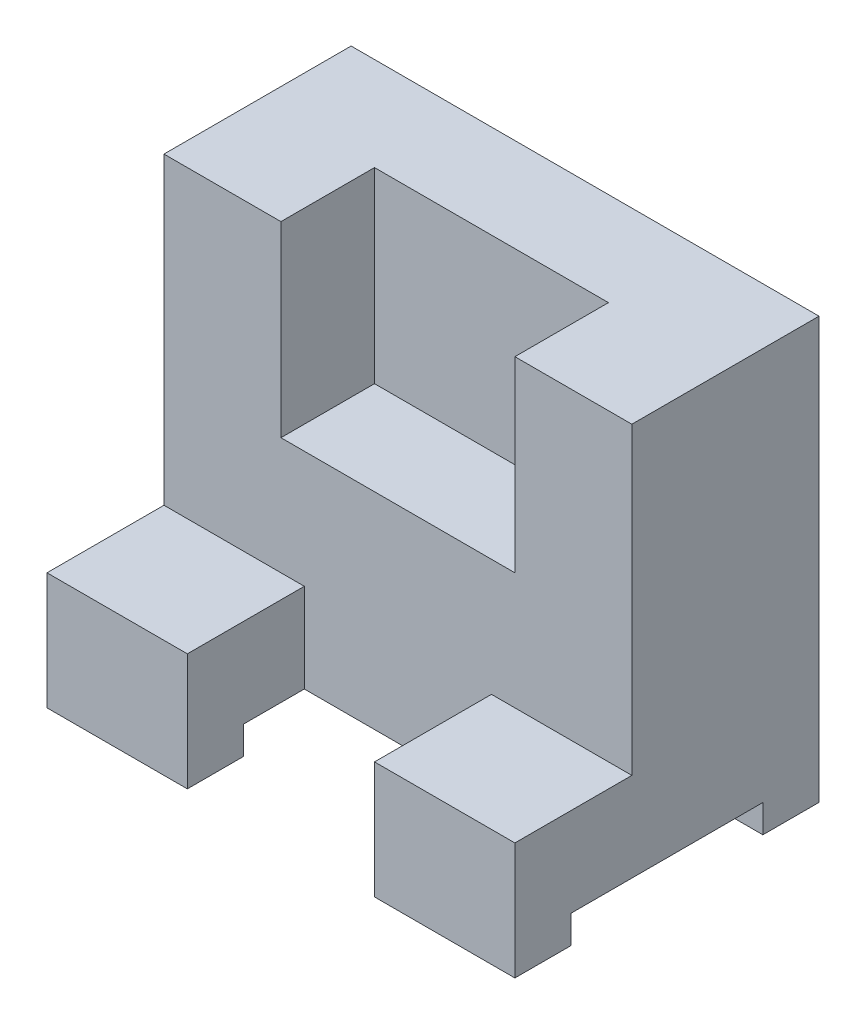
ISO-10303-21;
HEADER;
FILE_DESCRIPTION(('STEP AP214'),'2;1');
FILE_NAME('part.step','',(''),(''),'','','');
FILE_SCHEMA(('AUTOMOTIVE_DESIGN { 1 0 10303 214 1 1 1 1 }'));
ENDSEC;
DATA;
#1=APPLICATION_CONTEXT('core data for automotive mechanical design processes');
#2=APPLICATION_PROTOCOL_DEFINITION('international standard','automotive_design',2000,#1);
#3=PRODUCT_CONTEXT('',#1,'mechanical');
#4=PRODUCT('Part','Part','',(#3));
#5=PRODUCT_RELATED_PRODUCT_CATEGORY('part','',(#4));
#6=PRODUCT_DEFINITION_FORMATION('','',#4);
#7=PRODUCT_DEFINITION_CONTEXT('part definition',#1,'design');
#8=PRODUCT_DEFINITION('design','',#6,#7);
#9=PRODUCT_DEFINITION_SHAPE('','',#8);
#10=(LENGTH_UNIT() NAMED_UNIT(*) SI_UNIT(.MILLI.,.METRE.));
#11=(NAMED_UNIT(*) PLANE_ANGLE_UNIT() SI_UNIT($,.RADIAN.));
#12=(NAMED_UNIT(*) SI_UNIT($,.STERADIAN.) SOLID_ANGLE_UNIT());
#13=UNCERTAINTY_MEASURE_WITH_UNIT(LENGTH_MEASURE(1.E-05),#10,'distance_accuracy_value','');
#14=(GEOMETRIC_REPRESENTATION_CONTEXT(3) GLOBAL_UNCERTAINTY_ASSIGNED_CONTEXT((#13)) GLOBAL_UNIT_ASSIGNED_CONTEXT((#10,
#11,#12)) REPRESENTATION_CONTEXT('',''));
#15=CARTESIAN_POINT('',(0.,0.,0.));
#16=DIRECTION('',(0.,0.,1.));
#17=DIRECTION('',(1.,0.,0.));
#18=AXIS2_PLACEMENT_3D('',#15,#16,#17);
#19=CARTESIAN_POINT('',(0.,0.,0.));
#20=DIRECTION('',(0.,1.,0.));
#21=DIRECTION('',(0.,0.,1.));
#22=AXIS2_PLACEMENT_3D('',#19,#20,#21);
#23=PLANE('',#22);
#24=DIRECTION('',(1.,0.,0.));
#25=VECTOR('',#24,1.);
#26=CARTESIAN_POINT('',(-50.,0.,32.5));
#27=LINE('',#26,#25);
#28=CARTESIAN_POINT('',(20.,0.,32.5));
#29=VERTEX_POINT('',#28);
#30=CARTESIAN_POINT('',(50.,0.,32.5));
#31=VERTEX_POINT('',#30);
#32=EDGE_CURVE('E232',#29,#31,#27,.T.);
#33=ORIENTED_EDGE('',*,*,#32,.F.);
#34=DIRECTION('',(0.,0.,1.));
#35=VECTOR('',#34,1.);
#36=CARTESIAN_POINT('',(20.,0.,-39.6699056602831));
#37=LINE('',#36,#35);
#38=CARTESIAN_POINT('',(20.,0.,20.5));
#39=VERTEX_POINT('',#38);
#40=EDGE_CURVE('E335',#39,#29,#37,.T.);
#41=ORIENTED_EDGE('',*,*,#40,.F.);
#42=DIRECTION('',(1.,0.,0.));
#43=VECTOR('',#42,1.);
#44=CARTESIAN_POINT('',(-50.,0.,20.5));
#45=LINE('',#44,#43);
#46=CARTESIAN_POINT('',(50.,0.,20.5));
#47=VERTEX_POINT('',#46);
#48=EDGE_CURVE('E255',#39,#47,#45,.T.);
#49=ORIENTED_EDGE('',*,*,#48,.T.);
#50=DIRECTION('',(0.,0.,-1.));
#51=VECTOR('',#50,1.);
#52=CARTESIAN_POINT('',(50.,0.,-32.5));
#53=LINE('',#52,#51);
#54=EDGE_CURVE('E223',#31,#47,#53,.T.);
#55=ORIENTED_EDGE('',*,*,#54,.F.);
#56=EDGE_LOOP('',(#33,#41,#49,#55));
#57=FACE_BOUND('',#56,.T.);
#58=ADVANCED_FACE('F37',(#57),#23,.F.);
#59=CARTESIAN_POINT('',(0.,25.,0.));
#60=DIRECTION('',(0.,1.,0.));
#61=DIRECTION('',(0.,0.,1.));
#62=AXIS2_PLACEMENT_3D('',#59,#60,#61);
#63=PLANE('',#62);
#64=DIRECTION('',(0.,0.,1.));
#65=VECTOR('',#64,1.);
#66=CARTESIAN_POINT('',(20.,25.,-39.6699056602831));
#67=LINE('',#66,#65);
#68=CARTESIAN_POINT('',(20.,25.,7.5));
#69=VERTEX_POINT('',#68);
#70=CARTESIAN_POINT('',(20.,25.,32.5));
#71=VERTEX_POINT('',#70);
#72=EDGE_CURVE('E185',#69,#71,#67,.T.);
#73=ORIENTED_EDGE('',*,*,#72,.T.);
#74=DIRECTION('',(1.,0.,0.));
#75=VECTOR('',#74,1.);
#76=CARTESIAN_POINT('',(-50.,25.,32.5));
#77=LINE('',#76,#75);
#78=CARTESIAN_POINT('',(50.,25.,32.5));
#79=VERTEX_POINT('',#78);
#80=EDGE_CURVE('E218',#71,#79,#77,.T.);
#81=ORIENTED_EDGE('',*,*,#80,.T.);
#82=DIRECTION('',(0.,0.,-1.));
#83=VECTOR('',#82,1.);
#84=CARTESIAN_POINT('',(50.,25.,-32.5));
#85=LINE('',#84,#83);
#86=CARTESIAN_POINT('',(50.,25.,7.5));
#87=VERTEX_POINT('',#86);
#88=EDGE_CURVE('E198',#79,#87,#85,.T.);
#89=ORIENTED_EDGE('',*,*,#88,.T.);
#90=DIRECTION('',(-1.,0.,0.));
#91=VECTOR('',#90,1.);
#92=CARTESIAN_POINT('',(50.,25.,7.5));
#93=LINE('',#92,#91);
#94=EDGE_CURVE('E180',#87,#69,#93,.T.);
#95=ORIENTED_EDGE('',*,*,#94,.T.);
#96=EDGE_LOOP('',(#73,#81,#89,#95));
#97=FACE_BOUND('',#96,.T.);
#98=ADVANCED_FACE('F196',(#97),#63,.T.);
#99=CARTESIAN_POINT('',(-50.,25.,32.5));
#100=DIRECTION('',(0.,0.,-1.));
#101=DIRECTION('',(-1.,0.,0.));
#102=AXIS2_PLACEMENT_3D('',#99,#100,#101);
#103=PLANE('',#102);
#104=ORIENTED_EDGE('',*,*,#80,.F.);
#105=DIRECTION('',(0.,1.,0.));
#106=VECTOR('',#105,1.);
#107=CARTESIAN_POINT('',(20.,25.,32.5));
#108=LINE('',#107,#106);
#109=EDGE_CURVE('E191',#29,#71,#108,.T.);
#110=ORIENTED_EDGE('',*,*,#109,.F.);
#111=ORIENTED_EDGE('',*,*,#32,.T.);
#112=DIRECTION('',(0.,-1.,0.));
#113=VECTOR('',#112,1.);
#114=CARTESIAN_POINT('',(50.,25.,32.5));
#115=LINE('',#114,#113);
#116=EDGE_CURVE('E222',#79,#31,#115,.T.);
#117=ORIENTED_EDGE('',*,*,#116,.F.);
#118=EDGE_LOOP('',(#104,#110,#111,#117));
#119=FACE_BOUND('',#118,.T.);
#120=ADVANCED_FACE('F371',(#119),#103,.F.);
#121=CARTESIAN_POINT('',(-50.,0.,20.5));
#122=DIRECTION('',(0.,0.,1.));
#123=DIRECTION('',(1.,0.,0.));
#124=AXIS2_PLACEMENT_3D('',#121,#122,#123);
#125=PLANE('',#124);
#126=ORIENTED_EDGE('',*,*,#48,.F.);
#127=DIRECTION('',(0.,1.,0.));
#128=VECTOR('',#127,1.);
#129=CARTESIAN_POINT('',(20.,0.,20.5));
#130=LINE('',#129,#128);
#131=CARTESIAN_POINT('',(20.,5.98507619216385,20.5));
#132=VERTEX_POINT('',#131);
#133=EDGE_CURVE('E45',#39,#132,#130,.T.);
#134=ORIENTED_EDGE('',*,*,#133,.T.);
#135=DIRECTION('',(1.,0.,0.));
#136=VECTOR('',#135,1.);
#137=CARTESIAN_POINT('',(-50.,5.98507619216385,20.5));
#138=LINE('',#137,#136);
#139=CARTESIAN_POINT('',(50.,5.98507619216385,20.5));
#140=VERTEX_POINT('',#139);
#141=EDGE_CURVE('E253',#132,#140,#138,.T.);
#142=ORIENTED_EDGE('',*,*,#141,.T.);
#143=DIRECTION('',(0.,1.,0.));
#144=VECTOR('',#143,1.);
#145=CARTESIAN_POINT('',(50.,25.,20.5));
#146=LINE('',#145,#144);
#147=EDGE_CURVE('E279',#47,#140,#146,.T.);
#148=ORIENTED_EDGE('',*,*,#147,.F.);
#149=EDGE_LOOP('',(#126,#134,#142,#148));
#150=FACE_BOUND('',#149,.T.);
#151=ADVANCED_FACE('F251',(#150),#125,.F.);
#152=CARTESIAN_POINT('',(-50.,0.,20.5));
#153=VERTEX_POINT('',#152);
#154=CARTESIAN_POINT('',(-20.,0.,20.5));
#155=VERTEX_POINT('',#154);
#156=EDGE_CURVE('E271',#153,#155,#45,.T.);
#157=ORIENTED_EDGE('',*,*,#156,.T.);
#158=DIRECTION('',(0.,0.,1.));
#159=VECTOR('',#158,1.);
#160=CARTESIAN_POINT('',(-20.,0.,-39.6699056602831));
#161=LINE('',#160,#159);
#162=CARTESIAN_POINT('',(-20.,0.,32.5));
#163=VERTEX_POINT('',#162);
#164=EDGE_CURVE('E52',#155,#163,#161,.T.);
#165=ORIENTED_EDGE('',*,*,#164,.T.);
#166=CARTESIAN_POINT('',(-50.,0.,32.5));
#167=VERTEX_POINT('',#166);
#168=EDGE_CURVE('E216',#167,#163,#27,.T.);
#169=ORIENTED_EDGE('',*,*,#168,.F.);
#170=DIRECTION('',(0.,0.,1.));
#171=VECTOR('',#170,1.);
#172=CARTESIAN_POINT('',(-50.,0.,-32.5));
#173=LINE('',#172,#171);
#174=EDGE_CURVE('E228',#153,#167,#173,.T.);
#175=ORIENTED_EDGE('',*,*,#174,.F.);
#176=EDGE_LOOP('',(#157,#165,#169,#175));
#177=FACE_BOUND('',#176,.T.);
#178=ADVANCED_FACE('F351',(#177),#23,.F.);
#179=DIRECTION('',(0.,0.,1.));
#180=VECTOR('',#179,1.);
#181=CARTESIAN_POINT('',(-20.,25.,-39.6699056602831));
#182=LINE('',#181,#180);
#183=CARTESIAN_POINT('',(-20.,25.,7.5));
#184=VERTEX_POINT('',#183);
#185=CARTESIAN_POINT('',(-20.,25.,32.5));
#186=VERTEX_POINT('',#185);
#187=EDGE_CURVE('E194',#184,#186,#182,.T.);
#188=ORIENTED_EDGE('',*,*,#187,.F.);
#189=CARTESIAN_POINT('',(-50.,25.,7.5));
#190=VERTEX_POINT('',#189);
#191=EDGE_CURVE('E200',#184,#190,#93,.T.);
#192=ORIENTED_EDGE('',*,*,#191,.T.);
#193=DIRECTION('',(0.,0.,1.));
#194=VECTOR('',#193,1.);
#195=CARTESIAN_POINT('',(-50.,25.,-32.5));
#196=LINE('',#195,#194);
#197=CARTESIAN_POINT('',(-50.,25.,32.5));
#198=VERTEX_POINT('',#197);
#199=EDGE_CURVE('E215',#190,#198,#196,.T.);
#200=ORIENTED_EDGE('',*,*,#199,.T.);
#201=EDGE_CURVE('E219',#198,#186,#77,.T.);
#202=ORIENTED_EDGE('',*,*,#201,.T.);
#203=EDGE_LOOP('',(#188,#192,#200,#202));
#204=FACE_BOUND('',#203,.T.);
#205=ADVANCED_FACE('F328',(#204),#63,.T.);
#206=CARTESIAN_POINT('',(50.,25.,-32.5));
#207=DIRECTION('',(-1.,0.,0.));
#208=DIRECTION('',(0.,0.,1.));
#209=AXIS2_PLACEMENT_3D('',#206,#207,#208);
#210=PLANE('',#209);
#211=ORIENTED_EDGE('',*,*,#54,.T.);
#212=ORIENTED_EDGE('',*,*,#147,.T.);
#213=DIRECTION('',(0.,0.,-1.));
#214=VECTOR('',#213,1.);
#215=CARTESIAN_POINT('',(50.,5.98507619216385,-32.5));
#216=LINE('',#215,#214);
#217=CARTESIAN_POINT('',(50.,5.98507619216385,-20.5));
#218=VERTEX_POINT('',#217);
#219=EDGE_CURVE('E262',#140,#218,#216,.T.);
#220=ORIENTED_EDGE('',*,*,#219,.T.);
#221=DIRECTION('',(0.,-1.,0.));
#222=VECTOR('',#221,1.);
#223=CARTESIAN_POINT('',(50.,25.,-20.5));
#224=LINE('',#223,#222);
#225=CARTESIAN_POINT('',(50.,0.,-20.5));
#226=VERTEX_POINT('',#225);
#227=EDGE_CURVE('E276',#218,#226,#224,.T.);
#228=ORIENTED_EDGE('',*,*,#227,.T.);
#229=CARTESIAN_POINT('',(50.,0.,-32.5));
#230=VERTEX_POINT('',#229);
#231=EDGE_CURVE('E213',#226,#230,#53,.T.);
#232=ORIENTED_EDGE('',*,*,#231,.T.);
#233=DIRECTION('',(0.,-1.,0.));
#234=VECTOR('',#233,1.);
#235=CARTESIAN_POINT('',(50.,25.,-32.5));
#236=LINE('',#235,#234);
#237=CARTESIAN_POINT('',(50.,90.,-32.5));
#238=VERTEX_POINT('',#237);
#239=EDGE_CURVE('E243',#238,#230,#236,.T.);
#240=ORIENTED_EDGE('',*,*,#239,.F.);
#241=DIRECTION('',(0.,0.,1.));
#242=VECTOR('',#241,1.);
#243=CARTESIAN_POINT('',(50.,90.,-32.5));
#244=LINE('',#243,#242);
#245=CARTESIAN_POINT('',(50.,90.,7.50000000000001));
#246=VERTEX_POINT('',#245);
#247=EDGE_CURVE('E311',#238,#246,#244,.T.);
#248=ORIENTED_EDGE('',*,*,#247,.T.);
#249=DIRECTION('',(0.,-1.,0.));
#250=VECTOR('',#249,1.);
#251=CARTESIAN_POINT('',(50.,90.,7.50000000000001));
#252=LINE('',#251,#250);
#253=EDGE_CURVE('E204',#246,#87,#252,.T.);
#254=ORIENTED_EDGE('',*,*,#253,.T.);
#255=ORIENTED_EDGE('',*,*,#88,.F.);
#256=ORIENTED_EDGE('',*,*,#116,.T.);
#257=EDGE_LOOP('',(#211,#212,#220,#228,#232,#240,#248,#254,#255,#256));
#258=FACE_BOUND('',#257,.T.);
#259=ADVANCED_FACE('F39',(#258),#210,.F.);
#260=CARTESIAN_POINT('',(-50.,25.,-32.5));
#261=DIRECTION('',(0.,0.,1.));
#262=DIRECTION('',(1.,0.,0.));
#263=AXIS2_PLACEMENT_3D('',#260,#261,#262);
#264=PLANE('',#263);
#265=DIRECTION('',(-1.,0.,0.));
#266=VECTOR('',#265,1.);
#267=CARTESIAN_POINT('',(-50.,0.,-32.5));
#268=LINE('',#267,#266);
#269=CARTESIAN_POINT('',(-50.,0.,-32.5));
#270=VERTEX_POINT('',#269);
#271=EDGE_CURVE('E226',#230,#270,#268,.T.);
#272=ORIENTED_EDGE('',*,*,#271,.T.);
#273=DIRECTION('',(0.,-1.,0.));
#274=VECTOR('',#273,1.);
#275=CARTESIAN_POINT('',(-50.,25.,-32.5));
#276=LINE('',#275,#274);
#277=CARTESIAN_POINT('',(-50.,90.,-32.5));
#278=VERTEX_POINT('',#277);
#279=EDGE_CURVE('E240',#278,#270,#276,.T.);
#280=ORIENTED_EDGE('',*,*,#279,.F.);
#281=DIRECTION('',(-1.,0.,0.));
#282=VECTOR('',#281,1.);
#283=CARTESIAN_POINT('',(50.,90.,-32.5));
#284=LINE('',#283,#282);
#285=EDGE_CURVE('E210',#238,#278,#284,.T.);
#286=ORIENTED_EDGE('',*,*,#285,.F.);
#287=ORIENTED_EDGE('',*,*,#239,.T.);
#288=EDGE_LOOP('',(#272,#280,#286,#287));
#289=FACE_BOUND('',#288,.T.);
#290=ADVANCED_FACE('F390',(#289),#264,.F.);
#291=CARTESIAN_POINT('',(-50.,25.,-32.5));
#292=DIRECTION('',(1.,0.,0.));
#293=DIRECTION('',(0.,0.,-1.));
#294=AXIS2_PLACEMENT_3D('',#291,#292,#293);
#295=PLANE('',#294);
#296=DIRECTION('',(0.,0.,1.));
#297=VECTOR('',#296,1.);
#298=CARTESIAN_POINT('',(-50.,5.98507619216385,20.5));
#299=LINE('',#298,#297);
#300=CARTESIAN_POINT('',(-50.,5.98507619216385,-20.5));
#301=VERTEX_POINT('',#300);
#302=CARTESIAN_POINT('',(-50.,5.98507619216385,20.5));
#303=VERTEX_POINT('',#302);
#304=EDGE_CURVE('E342',#301,#303,#299,.T.);
#305=ORIENTED_EDGE('',*,*,#304,.T.);
#306=DIRECTION('',(0.,-1.,0.));
#307=VECTOR('',#306,1.);
#308=CARTESIAN_POINT('',(-50.,0.,20.5));
#309=LINE('',#308,#307);
#310=EDGE_CURVE('E275',#303,#153,#309,.T.);
#311=ORIENTED_EDGE('',*,*,#310,.T.);
#312=ORIENTED_EDGE('',*,*,#174,.T.);
#313=DIRECTION('',(0.,-1.,0.));
#314=VECTOR('',#313,1.);
#315=CARTESIAN_POINT('',(-50.,25.,32.5));
#316=LINE('',#315,#314);
#317=EDGE_CURVE('E237',#198,#167,#316,.T.);
#318=ORIENTED_EDGE('',*,*,#317,.F.);
#319=ORIENTED_EDGE('',*,*,#199,.F.);
#320=DIRECTION('',(0.,-1.,0.));
#321=VECTOR('',#320,1.);
#322=CARTESIAN_POINT('',(-50.,90.,7.50000000000001));
#323=LINE('',#322,#321);
#324=CARTESIAN_POINT('',(-50.,90.,7.50000000000001));
#325=VERTEX_POINT('',#324);
#326=EDGE_CURVE('E206',#325,#190,#323,.T.);
#327=ORIENTED_EDGE('',*,*,#326,.F.);
#328=DIRECTION('',(0.,0.,1.));
#329=VECTOR('',#328,1.);
#330=CARTESIAN_POINT('',(-50.,90.,-32.5));
#331=LINE('',#330,#329);
#332=EDGE_CURVE('E305',#278,#325,#331,.T.);
#333=ORIENTED_EDGE('',*,*,#332,.F.);
#334=ORIENTED_EDGE('',*,*,#279,.T.);
#335=CARTESIAN_POINT('',(-50.,0.,-20.5));
#336=VERTEX_POINT('',#335);
#337=EDGE_CURVE('E229',#270,#336,#173,.T.);
#338=ORIENTED_EDGE('',*,*,#337,.T.);
#339=DIRECTION('',(0.,1.,0.));
#340=VECTOR('',#339,1.);
#341=CARTESIAN_POINT('',(-50.,5.98507619216385,-20.5));
#342=LINE('',#341,#340);
#343=EDGE_CURVE('E60',#336,#301,#342,.T.);
#344=ORIENTED_EDGE('',*,*,#343,.T.);
#345=EDGE_LOOP('',(#305,#311,#312,#318,#319,#327,#333,#334,#338,#344));
#346=FACE_BOUND('',#345,.T.);
#347=ADVANCED_FACE('F324',(#346),#295,.F.);
#348=ORIENTED_EDGE('',*,*,#168,.T.);
#349=DIRECTION('',(0.,-1.,0.));
#350=VECTOR('',#349,1.);
#351=CARTESIAN_POINT('',(-20.,0.,32.5));
#352=LINE('',#351,#350);
#353=EDGE_CURVE('E186',#186,#163,#352,.T.);
#354=ORIENTED_EDGE('',*,*,#353,.F.);
#355=ORIENTED_EDGE('',*,*,#201,.F.);
#356=ORIENTED_EDGE('',*,*,#317,.T.);
#357=EDGE_LOOP('',(#348,#354,#355,#356));
#358=FACE_BOUND('',#357,.T.);
#359=ADVANCED_FACE('F353',(#358),#103,.F.);
#360=ORIENTED_EDGE('',*,*,#231,.F.);
#361=DIRECTION('',(1.,0.,0.));
#362=VECTOR('',#361,1.);
#363=CARTESIAN_POINT('',(-50.,0.,-20.5));
#364=LINE('',#363,#362);
#365=EDGE_CURVE('E268',#336,#226,#364,.T.);
#366=ORIENTED_EDGE('',*,*,#365,.F.);
#367=ORIENTED_EDGE('',*,*,#337,.F.);
#368=ORIENTED_EDGE('',*,*,#271,.F.);
#369=EDGE_LOOP('',(#360,#366,#367,#368));
#370=FACE_BOUND('',#369,.T.);
#371=ADVANCED_FACE('F367',(#370),#23,.F.);
#372=CARTESIAN_POINT('',(50.,90.,-32.5));
#373=DIRECTION('',(0.,-1.,0.));
#374=DIRECTION('',(0.,0.,-1.));
#375=AXIS2_PLACEMENT_3D('',#372,#373,#374);
#376=PLANE('',#375);
#377=DIRECTION('',(-1.,0.,0.));
#378=VECTOR('',#377,1.);
#379=CARTESIAN_POINT('',(50.,90.,7.50000000000001));
#380=LINE('',#379,#378);
#381=CARTESIAN_POINT('',(-25.,90.,7.49999999999997));
#382=VERTEX_POINT('',#381);
#383=EDGE_CURVE('E199',#382,#325,#380,.T.);
#384=ORIENTED_EDGE('',*,*,#383,.F.);
#385=DIRECTION('',(0.,0.,1.));
#386=VECTOR('',#385,1.);
#387=CARTESIAN_POINT('',(-25.,90.,7.49999999999997));
#388=LINE('',#387,#386);
#389=CARTESIAN_POINT('',(-25.,90.,-12.5));
#390=VERTEX_POINT('',#389);
#391=EDGE_CURVE('E287',#390,#382,#388,.T.);
#392=ORIENTED_EDGE('',*,*,#391,.F.);
#393=DIRECTION('',(-1.,0.,0.));
#394=VECTOR('',#393,1.);
#395=CARTESIAN_POINT('',(-25.,90.,-12.5));
#396=LINE('',#395,#394);
#397=CARTESIAN_POINT('',(25.,90.,-12.5));
#398=VERTEX_POINT('',#397);
#399=EDGE_CURVE('E298',#398,#390,#396,.T.);
#400=ORIENTED_EDGE('',*,*,#399,.F.);
#401=DIRECTION('',(0.,0.,-1.));
#402=VECTOR('',#401,1.);
#403=CARTESIAN_POINT('',(25.,90.,-12.5));
#404=LINE('',#403,#402);
#405=CARTESIAN_POINT('',(25.,90.,7.49999999999997));
#406=VERTEX_POINT('',#405);
#407=EDGE_CURVE('E282',#406,#398,#404,.T.);
#408=ORIENTED_EDGE('',*,*,#407,.F.);
#409=EDGE_CURVE('E202',#246,#406,#380,.T.);
#410=ORIENTED_EDGE('',*,*,#409,.F.);
#411=ORIENTED_EDGE('',*,*,#247,.F.);
#412=ORIENTED_EDGE('',*,*,#285,.T.);
#413=ORIENTED_EDGE('',*,*,#332,.T.);
#414=EDGE_LOOP('',(#384,#392,#400,#408,#410,#411,#412,#413));
#415=FACE_BOUND('',#414,.T.);
#416=ADVANCED_FACE('F377',(#415),#376,.F.);
#417=CARTESIAN_POINT('',(50.,90.,7.50000000000001));
#418=DIRECTION('',(0.,0.,-1.));
#419=DIRECTION('',(0.,1.,0.));
#420=AXIS2_PLACEMENT_3D('',#417,#418,#419);
#421=PLANE('',#420);
#422=DIRECTION('',(1.,0.,0.));
#423=VECTOR('',#422,1.);
#424=CARTESIAN_POINT('',(25.,50.,7.49999999999995));
#425=LINE('',#424,#423);
#426=CARTESIAN_POINT('',(-25.,50.,7.5));
#427=VERTEX_POINT('',#426);
#428=CARTESIAN_POINT('',(25.,50.,7.49999999999995));
#429=VERTEX_POINT('',#428);
#430=EDGE_CURVE('E283',#427,#429,#425,.T.);
#431=ORIENTED_EDGE('',*,*,#430,.F.);
#432=DIRECTION('',(0.,1.,0.));
#433=VECTOR('',#432,1.);
#434=CARTESIAN_POINT('',(-25.,50.,7.49999999999995));
#435=LINE('',#434,#433);
#436=EDGE_CURVE('E302',#427,#382,#435,.T.);
#437=ORIENTED_EDGE('',*,*,#436,.T.);
#438=ORIENTED_EDGE('',*,*,#383,.T.);
#439=ORIENTED_EDGE('',*,*,#326,.T.);
#440=ORIENTED_EDGE('',*,*,#191,.F.);
#441=DIRECTION('',(0.,-1.,0.));
#442=VECTOR('',#441,1.);
#443=CARTESIAN_POINT('',(-20.,0.,7.5));
#444=LINE('',#443,#442);
#445=CARTESIAN_POINT('',(-20.,5.98507619216385,7.5));
#446=VERTEX_POINT('',#445);
#447=EDGE_CURVE('E330',#184,#446,#444,.T.);
#448=ORIENTED_EDGE('',*,*,#447,.T.);
#449=DIRECTION('',(-1.,0.,0.));
#450=VECTOR('',#449,1.);
#451=CARTESIAN_POINT('',(-50.,5.98507619216385,7.5));
#452=LINE('',#451,#450);
#453=CARTESIAN_POINT('',(20.,5.98507619216385,7.5));
#454=VERTEX_POINT('',#453);
#455=EDGE_CURVE('E11',#454,#446,#452,.T.);
#456=ORIENTED_EDGE('',*,*,#455,.F.);
#457=DIRECTION('',(0.,1.,0.));
#458=VECTOR('',#457,1.);
#459=CARTESIAN_POINT('',(20.,25.,7.5));
#460=LINE('',#459,#458);
#461=EDGE_CURVE('E174',#454,#69,#460,.T.);
#462=ORIENTED_EDGE('',*,*,#461,.T.);
#463=ORIENTED_EDGE('',*,*,#94,.F.);
#464=ORIENTED_EDGE('',*,*,#253,.F.);
#465=ORIENTED_EDGE('',*,*,#409,.T.);
#466=DIRECTION('',(0.,1.,0.));
#467=VECTOR('',#466,1.);
#468=CARTESIAN_POINT('',(25.,50.,7.49999999999995));
#469=LINE('',#468,#467);
#470=EDGE_CURVE('E295',#429,#406,#469,.T.);
#471=ORIENTED_EDGE('',*,*,#470,.F.);
#472=EDGE_LOOP('',(#431,#437,#438,#439,#440,#448,#456,#462,#463,#464,#465,#471));
#473=FACE_BOUND('',#472,.T.);
#474=ADVANCED_FACE('F177',(#473),#421,.F.);
#475=CARTESIAN_POINT('',(-25.,50.,7.49999999999995));
#476=DIRECTION('',(-1.,0.,0.));
#477=DIRECTION('',(0.,0.,1.));
#478=AXIS2_PLACEMENT_3D('',#475,#476,#477);
#479=PLANE('',#478);
#480=ORIENTED_EDGE('',*,*,#391,.T.);
#481=ORIENTED_EDGE('',*,*,#436,.F.);
#482=DIRECTION('',(0.,0.,1.));
#483=VECTOR('',#482,1.);
#484=CARTESIAN_POINT('',(-25.,50.,7.49999999999995));
#485=LINE('',#484,#483);
#486=CARTESIAN_POINT('',(-25.,50.,-12.5));
#487=VERTEX_POINT('',#486);
#488=EDGE_CURVE('E293',#487,#427,#485,.T.);
#489=ORIENTED_EDGE('',*,*,#488,.F.);
#490=DIRECTION('',(0.,1.,0.));
#491=VECTOR('',#490,1.);
#492=CARTESIAN_POINT('',(-25.,50.,-12.5));
#493=LINE('',#492,#491);
#494=EDGE_CURVE('E306',#487,#390,#493,.T.);
#495=ORIENTED_EDGE('',*,*,#494,.T.);
#496=EDGE_LOOP('',(#480,#481,#489,#495));
#497=FACE_BOUND('',#496,.T.);
#498=ADVANCED_FACE('F407',(#497),#479,.F.);
#499=CARTESIAN_POINT('',(-25.,50.,-12.5));
#500=DIRECTION('',(0.,0.,-1.));
#501=DIRECTION('',(0.,1.,0.));
#502=AXIS2_PLACEMENT_3D('',#499,#500,#501);
#503=PLANE('',#502);
#504=ORIENTED_EDGE('',*,*,#399,.T.);
#505=ORIENTED_EDGE('',*,*,#494,.F.);
#506=DIRECTION('',(-1.,0.,0.));
#507=VECTOR('',#506,1.);
#508=CARTESIAN_POINT('',(-25.,50.,-12.5));
#509=LINE('',#508,#507);
#510=CARTESIAN_POINT('',(25.,50.,-12.5));
#511=VERTEX_POINT('',#510);
#512=EDGE_CURVE('E290',#511,#487,#509,.T.);
#513=ORIENTED_EDGE('',*,*,#512,.F.);
#514=DIRECTION('',(0.,1.,0.));
#515=VECTOR('',#514,1.);
#516=CARTESIAN_POINT('',(25.,50.,-12.5));
#517=LINE('',#516,#515);
#518=EDGE_CURVE('E308',#511,#398,#517,.T.);
#519=ORIENTED_EDGE('',*,*,#518,.T.);
#520=EDGE_LOOP('',(#504,#505,#513,#519));
#521=FACE_BOUND('',#520,.T.);
#522=ADVANCED_FACE('F400',(#521),#503,.F.);
#523=CARTESIAN_POINT('',(25.,50.,-12.5));
#524=DIRECTION('',(1.,0.,0.));
#525=DIRECTION('',(0.,0.,-1.));
#526=AXIS2_PLACEMENT_3D('',#523,#524,#525);
#527=PLANE('',#526);
#528=ORIENTED_EDGE('',*,*,#407,.T.);
#529=ORIENTED_EDGE('',*,*,#518,.F.);
#530=DIRECTION('',(0.,0.,-1.));
#531=VECTOR('',#530,1.);
#532=CARTESIAN_POINT('',(25.,50.,-12.5));
#533=LINE('',#532,#531);
#534=EDGE_CURVE('E286',#429,#511,#533,.T.);
#535=ORIENTED_EDGE('',*,*,#534,.F.);
#536=ORIENTED_EDGE('',*,*,#470,.T.);
#537=EDGE_LOOP('',(#528,#529,#535,#536));
#538=FACE_BOUND('',#537,.T.);
#539=ADVANCED_FACE('F396',(#538),#527,.F.);
#540=CARTESIAN_POINT('',(0.,50.,0.));
#541=DIRECTION('',(0.,-1.,0.));
#542=DIRECTION('',(0.,0.,-1.));
#543=AXIS2_PLACEMENT_3D('',#540,#541,#542);
#544=PLANE('',#543);
#545=ORIENTED_EDGE('',*,*,#430,.T.);
#546=ORIENTED_EDGE('',*,*,#534,.T.);
#547=ORIENTED_EDGE('',*,*,#512,.T.);
#548=ORIENTED_EDGE('',*,*,#488,.T.);
#549=EDGE_LOOP('',(#545,#546,#547,#548));
#550=FACE_BOUND('',#549,.T.);
#551=ADVANCED_FACE('F404',(#550),#544,.F.);
#552=CARTESIAN_POINT('',(-50.,5.98507619216385,20.5));
#553=DIRECTION('',(0.,1.,0.));
#554=DIRECTION('',(0.,0.,1.));
#555=AXIS2_PLACEMENT_3D('',#552,#553,#554);
#556=PLANE('',#555);
#557=ORIENTED_EDGE('',*,*,#141,.F.);
#558=DIRECTION('',(0.,0.,-1.));
#559=VECTOR('',#558,1.);
#560=CARTESIAN_POINT('',(20.,5.98507619216385,20.5));
#561=LINE('',#560,#559);
#562=EDGE_CURVE('E259',#132,#454,#561,.T.);
#563=ORIENTED_EDGE('',*,*,#562,.T.);
#564=ORIENTED_EDGE('',*,*,#455,.T.);
#565=DIRECTION('',(0.,0.,1.));
#566=VECTOR('',#565,1.);
#567=CARTESIAN_POINT('',(-20.,5.98507619216385,20.5));
#568=LINE('',#567,#566);
#569=CARTESIAN_POINT('',(-20.,5.98507619216385,20.5));
#570=VERTEX_POINT('',#569);
#571=EDGE_CURVE('E337',#446,#570,#568,.T.);
#572=ORIENTED_EDGE('',*,*,#571,.T.);
#573=EDGE_CURVE('E264',#303,#570,#138,.T.);
#574=ORIENTED_EDGE('',*,*,#573,.F.);
#575=ORIENTED_EDGE('',*,*,#304,.F.);
#576=DIRECTION('',(1.,0.,0.));
#577=VECTOR('',#576,1.);
#578=CARTESIAN_POINT('',(-50.,5.98507619216385,-20.5));
#579=LINE('',#578,#577);
#580=EDGE_CURVE('E265',#301,#218,#579,.T.);
#581=ORIENTED_EDGE('',*,*,#580,.T.);
#582=ORIENTED_EDGE('',*,*,#219,.F.);
#583=EDGE_LOOP('',(#557,#563,#564,#572,#574,#575,#581,#582));
#584=FACE_BOUND('',#583,.T.);
#585=ADVANCED_FACE('F258',(#584),#556,.F.);
#586=ORIENTED_EDGE('',*,*,#573,.T.);
#587=DIRECTION('',(0.,-1.,0.));
#588=VECTOR('',#587,1.);
#589=CARTESIAN_POINT('',(-20.,0.,20.5));
#590=LINE('',#589,#588);
#591=EDGE_CURVE('E246',#570,#155,#590,.T.);
#592=ORIENTED_EDGE('',*,*,#591,.T.);
#593=ORIENTED_EDGE('',*,*,#156,.F.);
#594=ORIENTED_EDGE('',*,*,#310,.F.);
#595=EDGE_LOOP('',(#586,#592,#593,#594));
#596=FACE_BOUND('',#595,.T.);
#597=ADVANCED_FACE('F461',(#596),#125,.F.);
#598=CARTESIAN_POINT('',(-50.,5.98507619216385,-20.5));
#599=DIRECTION('',(0.,0.,-1.));
#600=DIRECTION('',(0.,1.,0.));
#601=AXIS2_PLACEMENT_3D('',#598,#599,#600);
#602=PLANE('',#601);
#603=ORIENTED_EDGE('',*,*,#580,.F.);
#604=ORIENTED_EDGE('',*,*,#343,.F.);
#605=ORIENTED_EDGE('',*,*,#365,.T.);
#606=ORIENTED_EDGE('',*,*,#227,.F.);
#607=EDGE_LOOP('',(#603,#604,#605,#606));
#608=FACE_BOUND('',#607,.T.);
#609=ADVANCED_FACE('F362',(#608),#602,.F.);
#610=CARTESIAN_POINT('',(20.,25.,-39.6699056602831));
#611=DIRECTION('',(1.,0.,0.));
#612=DIRECTION('',(0.,0.,-1.));
#613=AXIS2_PLACEMENT_3D('',#610,#611,#612);
#614=PLANE('',#613);
#615=ORIENTED_EDGE('',*,*,#133,.F.);
#616=ORIENTED_EDGE('',*,*,#40,.T.);
#617=ORIENTED_EDGE('',*,*,#109,.T.);
#618=ORIENTED_EDGE('',*,*,#72,.F.);
#619=ORIENTED_EDGE('',*,*,#461,.F.);
#620=ORIENTED_EDGE('',*,*,#562,.F.);
#621=EDGE_LOOP('',(#615,#616,#617,#618,#619,#620));
#622=FACE_BOUND('',#621,.T.);
#623=ADVANCED_FACE('F189',(#622),#614,.F.);
#624=CARTESIAN_POINT('',(-20.,0.,-39.6699056602831));
#625=DIRECTION('',(-1.,0.,0.));
#626=DIRECTION('',(0.,0.,1.));
#627=AXIS2_PLACEMENT_3D('',#624,#625,#626);
#628=PLANE('',#627);
#629=ORIENTED_EDGE('',*,*,#447,.F.);
#630=ORIENTED_EDGE('',*,*,#187,.T.);
#631=ORIENTED_EDGE('',*,*,#353,.T.);
#632=ORIENTED_EDGE('',*,*,#164,.F.);
#633=ORIENTED_EDGE('',*,*,#591,.F.);
#634=ORIENTED_EDGE('',*,*,#571,.F.);
#635=EDGE_LOOP('',(#629,#630,#631,#632,#633,#634));
#636=FACE_BOUND('',#635,.T.);
#637=ADVANCED_FACE('F356',(#636),#628,.F.);
#638=CLOSED_SHELL('',(#58,#98,#120,#151,#178,#205,#259,#290,#347,#359,#371,#416,#474,#498,#522,
#539,#551,#585,#597,#609,#623,#637));
#639=MANIFOLD_SOLID_BREP('B2',#638);
#640=ADVANCED_BREP_SHAPE_REPRESENTATION('',(#18,#639),#14);
#641=SHAPE_DEFINITION_REPRESENTATION(#9,#640);
ENDSEC;
END-ISO-10303-21;
